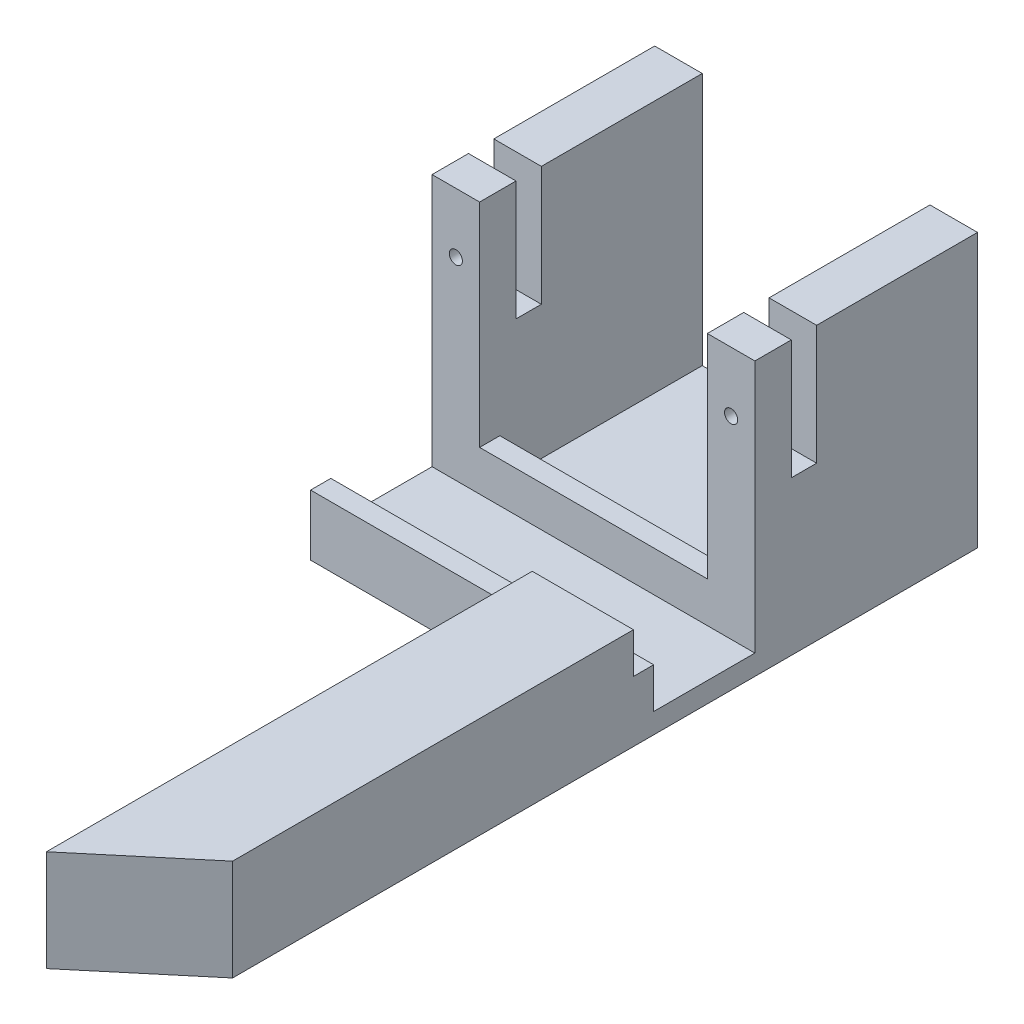
ISO-10303-21;
HEADER;
FILE_DESCRIPTION(('STEP AP214'),'2;1');
FILE_NAME('part.step','',(''),(''),'','','');
FILE_SCHEMA(('AUTOMOTIVE_DESIGN { 1 0 10303 214 1 1 1 1 }'));
ENDSEC;
DATA;
#1=APPLICATION_CONTEXT('core data for automotive mechanical design processes');
#2=APPLICATION_PROTOCOL_DEFINITION('international standard','automotive_design',2000,#1);
#3=PRODUCT_CONTEXT('',#1,'mechanical');
#4=PRODUCT('Part','Part','',(#3));
#5=PRODUCT_RELATED_PRODUCT_CATEGORY('part','',(#4));
#6=PRODUCT_DEFINITION_FORMATION('','',#4);
#7=PRODUCT_DEFINITION_CONTEXT('part definition',#1,'design');
#8=PRODUCT_DEFINITION('design','',#6,#7);
#9=PRODUCT_DEFINITION_SHAPE('','',#8);
#10=(LENGTH_UNIT() NAMED_UNIT(*) SI_UNIT(.MILLI.,.METRE.));
#11=(NAMED_UNIT(*) PLANE_ANGLE_UNIT() SI_UNIT($,.RADIAN.));
#12=(NAMED_UNIT(*) SI_UNIT($,.STERADIAN.) SOLID_ANGLE_UNIT());
#13=UNCERTAINTY_MEASURE_WITH_UNIT(LENGTH_MEASURE(1.E-05),#10,'distance_accuracy_value','');
#14=(GEOMETRIC_REPRESENTATION_CONTEXT(3) GLOBAL_UNCERTAINTY_ASSIGNED_CONTEXT((#13)) GLOBAL_UNIT_ASSIGNED_CONTEXT((#10,
#11,#12)) REPRESENTATION_CONTEXT('',''));
#15=CARTESIAN_POINT('',(0.,0.,0.));
#16=DIRECTION('',(0.,0.,1.));
#17=DIRECTION('',(1.,0.,0.));
#18=AXIS2_PLACEMENT_3D('',#15,#16,#17);
#19=CARTESIAN_POINT('',(-15.95,2.,17.));
#20=DIRECTION('',(0.,0.,-1.));
#21=DIRECTION('',(-1.,0.,0.));
#22=AXIS2_PLACEMENT_3D('',#19,#20,#21);
#23=PLANE('',#22);
#24=DIRECTION('',(0.,-1.,0.));
#25=VECTOR('',#24,1.);
#26=CARTESIAN_POINT('',(5.95,10.,17.));
#27=LINE('',#26,#25);
#28=CARTESIAN_POINT('',(5.95,6.,17.));
#29=VERTEX_POINT('',#28);
#30=CARTESIAN_POINT('',(5.95,0.,17.));
#31=VERTEX_POINT('',#30);
#32=EDGE_CURVE('E11',#29,#31,#27,.T.);
#33=ORIENTED_EDGE('',*,*,#32,.F.);
#34=DIRECTION('',(1.,0.,0.));
#35=VECTOR('',#34,1.);
#36=CARTESIAN_POINT('',(-15.95,6.,17.));
#37=LINE('',#36,#35);
#38=CARTESIAN_POINT('',(-15.95,6.,17.));
#39=VERTEX_POINT('',#38);
#40=EDGE_CURVE('E337',#39,#29,#37,.T.);
#41=ORIENTED_EDGE('',*,*,#40,.F.);
#42=DIRECTION('',(0.,-1.,0.));
#43=VECTOR('',#42,1.);
#44=CARTESIAN_POINT('',(-15.95,2.,17.));
#45=LINE('',#44,#43);
#46=CARTESIAN_POINT('',(-15.95,0.,17.));
#47=VERTEX_POINT('',#46);
#48=EDGE_CURVE('E447',#39,#47,#45,.T.);
#49=ORIENTED_EDGE('',*,*,#48,.T.);
#50=DIRECTION('',(1.,0.,0.));
#51=VECTOR('',#50,1.);
#52=CARTESIAN_POINT('',(-15.95,0.,17.));
#53=LINE('',#52,#51);
#54=EDGE_CURVE('E441',#47,#31,#53,.T.);
#55=ORIENTED_EDGE('',*,*,#54,.T.);
#56=EDGE_LOOP('',(#33,#41,#49,#55));
#57=FACE_BOUND('',#56,.T.);
#58=ADVANCED_FACE('F45',(#57),#23,.F.);
#59=CARTESIAN_POINT('',(-11.25,27.,-17.));
#60=DIRECTION('',(1.,0.,0.));
#61=DIRECTION('',(0.,0.,-1.));
#62=AXIS2_PLACEMENT_3D('',#59,#60,#61);
#63=PLANE('',#62);
#64=DIRECTION('',(0.,0.,1.));
#65=VECTOR('',#64,1.);
#66=CARTESIAN_POINT('',(-11.25,27.,-17.));
#67=LINE('',#66,#65);
#68=CARTESIAN_POINT('',(-11.25,27.,-17.));
#69=VERTEX_POINT('',#68);
#70=CARTESIAN_POINT('',(-11.25,27.,-1.09999999999999));
#71=VERTEX_POINT('',#70);
#72=EDGE_CURVE('E406',#69,#71,#67,.T.);
#73=ORIENTED_EDGE('',*,*,#72,.T.);
#74=DIRECTION('',(0.,-1.,0.));
#75=VECTOR('',#74,1.);
#76=CARTESIAN_POINT('',(-11.25,27.,-1.1));
#77=LINE('',#76,#75);
#78=CARTESIAN_POINT('',(-11.25,15.2,-1.09999999999999));
#79=VERTEX_POINT('',#78);
#80=EDGE_CURVE('E306',#71,#79,#77,.T.);
#81=ORIENTED_EDGE('',*,*,#80,.T.);
#82=DIRECTION('',(0.,0.,1.));
#83=VECTOR('',#82,1.);
#84=CARTESIAN_POINT('',(-11.25,15.2,-17.));
#85=LINE('',#84,#83);
#86=CARTESIAN_POINT('',(-11.25,15.2,1.40000000000001));
#87=VERTEX_POINT('',#86);
#88=EDGE_CURVE('E313',#79,#87,#85,.T.);
#89=ORIENTED_EDGE('',*,*,#88,.T.);
#90=DIRECTION('',(0.,-1.,0.));
#91=VECTOR('',#90,1.);
#92=CARTESIAN_POINT('',(-11.25,27.,1.40000000000001));
#93=LINE('',#92,#91);
#94=CARTESIAN_POINT('',(-11.25,27.,1.40000000000001));
#95=VERTEX_POINT('',#94);
#96=EDGE_CURVE('E300',#95,#87,#93,.T.);
#97=ORIENTED_EDGE('',*,*,#96,.F.);
#98=CARTESIAN_POINT('',(-11.25,27.,5.00000000000001));
#99=VERTEX_POINT('',#98);
#100=EDGE_CURVE('E404',#95,#99,#67,.T.);
#101=ORIENTED_EDGE('',*,*,#100,.T.);
#102=DIRECTION('',(0.,-1.,0.));
#103=VECTOR('',#102,1.);
#104=CARTESIAN_POINT('',(-11.25,27.,5.00000000000001));
#105=LINE('',#104,#103);
#106=CARTESIAN_POINT('',(-11.25,6.,5.00000000000001));
#107=VERTEX_POINT('',#106);
#108=EDGE_CURVE('E432',#99,#107,#105,.T.);
#109=ORIENTED_EDGE('',*,*,#108,.T.);
#110=DIRECTION('',(0.,0.,1.));
#111=VECTOR('',#110,1.);
#112=CARTESIAN_POINT('',(-11.25,6.,5.00000000000001));
#113=LINE('',#112,#111);
#114=CARTESIAN_POINT('',(-11.25,6.,3.00000000000001));
#115=VERTEX_POINT('',#114);
#116=EDGE_CURVE('E343',#115,#107,#113,.T.);
#117=ORIENTED_EDGE('',*,*,#116,.F.);
#118=DIRECTION('',(0.,-1.,0.));
#119=VECTOR('',#118,1.);
#120=CARTESIAN_POINT('',(-11.25,6.,3.00000000000001));
#121=LINE('',#120,#119);
#122=CARTESIAN_POINT('',(-11.25,2.,3.00000000000001));
#123=VERTEX_POINT('',#122);
#124=EDGE_CURVE('E356',#115,#123,#121,.T.);
#125=ORIENTED_EDGE('',*,*,#124,.T.);
#126=DIRECTION('',(0.,0.,1.));
#127=VECTOR('',#126,1.);
#128=CARTESIAN_POINT('',(-11.25,2.,-17.));
#129=LINE('',#128,#127);
#130=CARTESIAN_POINT('',(-11.25,2.,-17.));
#131=VERTEX_POINT('',#130);
#132=EDGE_CURVE('E405',#131,#123,#129,.T.);
#133=ORIENTED_EDGE('',*,*,#132,.F.);
#134=DIRECTION('',(0.,-1.,0.));
#135=VECTOR('',#134,1.);
#136=CARTESIAN_POINT('',(-11.25,27.,-17.));
#137=LINE('',#136,#135);
#138=EDGE_CURVE('E428',#69,#131,#137,.T.);
#139=ORIENTED_EDGE('',*,*,#138,.F.);
#140=EDGE_LOOP('',(#73,#81,#89,#97,#101,#109,#117,#125,#133,#139));
#141=FACE_BOUND('',#140,.T.);
#142=ADVANCED_FACE('F500',(#141),#63,.T.);
#143=CARTESIAN_POINT('',(11.25,27.,-17.));
#144=DIRECTION('',(1.,0.,0.));
#145=DIRECTION('',(0.,0.,-1.));
#146=AXIS2_PLACEMENT_3D('',#143,#144,#145);
#147=PLANE('',#146);
#148=DIRECTION('',(0.,-1.,0.));
#149=VECTOR('',#148,1.);
#150=CARTESIAN_POINT('',(11.25,27.,-1.1));
#151=LINE('',#150,#149);
#152=CARTESIAN_POINT('',(11.25,27.,-1.09999999999999));
#153=VERTEX_POINT('',#152);
#154=CARTESIAN_POINT('',(11.25,15.2,-1.09999999999999));
#155=VERTEX_POINT('',#154);
#156=EDGE_CURVE('E303',#153,#155,#151,.T.);
#157=ORIENTED_EDGE('',*,*,#156,.F.);
#158=DIRECTION('',(0.,0.,1.));
#159=VECTOR('',#158,1.);
#160=CARTESIAN_POINT('',(11.25,27.,-17.));
#161=LINE('',#160,#159);
#162=CARTESIAN_POINT('',(11.25,27.,-17.));
#163=VERTEX_POINT('',#162);
#164=EDGE_CURVE('E393',#163,#153,#161,.T.);
#165=ORIENTED_EDGE('',*,*,#164,.F.);
#166=DIRECTION('',(0.,-1.,0.));
#167=VECTOR('',#166,1.);
#168=CARTESIAN_POINT('',(11.25,27.,-17.));
#169=LINE('',#168,#167);
#170=CARTESIAN_POINT('',(11.25,2.,-17.));
#171=VERTEX_POINT('',#170);
#172=EDGE_CURVE('E365',#163,#171,#169,.T.);
#173=ORIENTED_EDGE('',*,*,#172,.T.);
#174=DIRECTION('',(0.,0.,1.));
#175=VECTOR('',#174,1.);
#176=CARTESIAN_POINT('',(11.25,2.,-17.));
#177=LINE('',#176,#175);
#178=CARTESIAN_POINT('',(11.25,2.,3.00000000000001));
#179=VERTEX_POINT('',#178);
#180=EDGE_CURVE('E378',#171,#179,#177,.T.);
#181=ORIENTED_EDGE('',*,*,#180,.T.);
#182=DIRECTION('',(0.,-1.,0.));
#183=VECTOR('',#182,1.);
#184=CARTESIAN_POINT('',(11.25,6.,3.00000000000001));
#185=LINE('',#184,#183);
#186=CARTESIAN_POINT('',(11.25,6.,3.00000000000001));
#187=VERTEX_POINT('',#186);
#188=EDGE_CURVE('E362',#187,#179,#185,.T.);
#189=ORIENTED_EDGE('',*,*,#188,.F.);
#190=DIRECTION('',(0.,0.,-1.));
#191=VECTOR('',#190,1.);
#192=CARTESIAN_POINT('',(11.25,6.,5.00000000000001));
#193=LINE('',#192,#191);
#194=CARTESIAN_POINT('',(11.25,6.,5.00000000000001));
#195=VERTEX_POINT('',#194);
#196=EDGE_CURVE('E350',#195,#187,#193,.T.);
#197=ORIENTED_EDGE('',*,*,#196,.F.);
#198=DIRECTION('',(0.,-1.,0.));
#199=VECTOR('',#198,1.);
#200=CARTESIAN_POINT('',(11.25,27.,5.00000000000001));
#201=LINE('',#200,#199);
#202=CARTESIAN_POINT('',(11.25,27.,5.00000000000001));
#203=VERTEX_POINT('',#202);
#204=EDGE_CURVE('E369',#203,#195,#201,.T.);
#205=ORIENTED_EDGE('',*,*,#204,.F.);
#206=CARTESIAN_POINT('',(11.25,27.,1.40000000000001));
#207=VERTEX_POINT('',#206);
#208=EDGE_CURVE('E392',#207,#203,#161,.T.);
#209=ORIENTED_EDGE('',*,*,#208,.F.);
#210=DIRECTION('',(0.,-1.,0.));
#211=VECTOR('',#210,1.);
#212=CARTESIAN_POINT('',(11.25,27.,1.40000000000001));
#213=LINE('',#212,#211);
#214=CARTESIAN_POINT('',(11.25,15.2,1.40000000000001));
#215=VERTEX_POINT('',#214);
#216=EDGE_CURVE('E287',#207,#215,#213,.T.);
#217=ORIENTED_EDGE('',*,*,#216,.T.);
#218=DIRECTION('',(0.,0.,1.));
#219=VECTOR('',#218,1.);
#220=CARTESIAN_POINT('',(11.25,15.2,-17.));
#221=LINE('',#220,#219);
#222=EDGE_CURVE('E310',#155,#215,#221,.T.);
#223=ORIENTED_EDGE('',*,*,#222,.F.);
#224=EDGE_LOOP('',(#157,#165,#173,#181,#189,#197,#205,#209,#217,#223));
#225=FACE_BOUND('',#224,.T.);
#226=ADVANCED_FACE('F506',(#225),#147,.F.);
#227=CARTESIAN_POINT('',(15.95,2.,-17.));
#228=DIRECTION('',(-1.,0.,0.));
#229=DIRECTION('',(0.,0.,1.));
#230=AXIS2_PLACEMENT_3D('',#227,#228,#229);
#231=PLANE('',#230);
#232=DIRECTION('',(0.,1.,0.));
#233=VECTOR('',#232,1.);
#234=CARTESIAN_POINT('',(15.95,15.2,-1.09999999999999));
#235=LINE('',#234,#233);
#236=CARTESIAN_POINT('',(15.95,15.2,-1.09999999999999));
#237=VERTEX_POINT('',#236);
#238=CARTESIAN_POINT('',(15.95,27.,-1.09999999999999));
#239=VERTEX_POINT('',#238);
#240=EDGE_CURVE('E284',#237,#239,#235,.T.);
#241=ORIENTED_EDGE('',*,*,#240,.F.);
#242=DIRECTION('',(0.,0.,1.));
#243=VECTOR('',#242,1.);
#244=CARTESIAN_POINT('',(15.95,15.2,0.));
#245=LINE('',#244,#243);
#246=CARTESIAN_POINT('',(15.95,15.2,1.40000000000001));
#247=VERTEX_POINT('',#246);
#248=EDGE_CURVE('E272',#237,#247,#245,.T.);
#249=ORIENTED_EDGE('',*,*,#248,.T.);
#250=DIRECTION('',(0.,1.,0.));
#251=VECTOR('',#250,1.);
#252=CARTESIAN_POINT('',(15.95,15.2,1.40000000000001));
#253=LINE('',#252,#251);
#254=CARTESIAN_POINT('',(15.95,27.,1.40000000000001));
#255=VERTEX_POINT('',#254);
#256=EDGE_CURVE('E288',#247,#255,#253,.T.);
#257=ORIENTED_EDGE('',*,*,#256,.T.);
#258=DIRECTION('',(0.,0.,1.));
#259=VECTOR('',#258,1.);
#260=CARTESIAN_POINT('',(15.95,27.,-17.));
#261=LINE('',#260,#259);
#262=CARTESIAN_POINT('',(15.95,27.,5.));
#263=VERTEX_POINT('',#262);
#264=EDGE_CURVE('E377',#255,#263,#261,.T.);
#265=ORIENTED_EDGE('',*,*,#264,.T.);
#266=DIRECTION('',(0.,-1.,0.));
#267=VECTOR('',#266,1.);
#268=CARTESIAN_POINT('',(15.95,27.,5.));
#269=LINE('',#268,#267);
#270=CARTESIAN_POINT('',(15.95,2.,5.));
#271=VERTEX_POINT('',#270);
#272=EDGE_CURVE('E373',#263,#271,#269,.T.);
#273=ORIENTED_EDGE('',*,*,#272,.T.);
#274=DIRECTION('',(0.,0.,-1.));
#275=VECTOR('',#274,1.);
#276=CARTESIAN_POINT('',(15.95,2.,-17.));
#277=LINE('',#276,#275);
#278=CARTESIAN_POINT('',(15.95,2.,15.));
#279=VERTEX_POINT('',#278);
#280=EDGE_CURVE('E437',#279,#271,#277,.T.);
#281=ORIENTED_EDGE('',*,*,#280,.F.);
#282=DIRECTION('',(0.,-1.,0.));
#283=VECTOR('',#282,1.);
#284=CARTESIAN_POINT('',(15.95,6.,15.));
#285=LINE('',#284,#283);
#286=CARTESIAN_POINT('',(15.95,6.,15.));
#287=VERTEX_POINT('',#286);
#288=EDGE_CURVE('E317',#287,#279,#285,.T.);
#289=ORIENTED_EDGE('',*,*,#288,.F.);
#290=DIRECTION('',(0.,0.,-1.));
#291=VECTOR('',#290,1.);
#292=CARTESIAN_POINT('',(15.95,6.,17.));
#293=LINE('',#292,#291);
#294=CARTESIAN_POINT('',(15.95,6.,17.));
#295=VERTEX_POINT('',#294);
#296=EDGE_CURVE('E334',#295,#287,#293,.T.);
#297=ORIENTED_EDGE('',*,*,#296,.F.);
#298=DIRECTION('',(0.,-1.,0.));
#299=VECTOR('',#298,1.);
#300=CARTESIAN_POINT('',(15.95,10.,17.));
#301=LINE('',#300,#299);
#302=CARTESIAN_POINT('',(15.95,10.,17.));
#303=VERTEX_POINT('',#302);
#304=EDGE_CURVE('E549',#303,#295,#301,.T.);
#305=ORIENTED_EDGE('',*,*,#304,.F.);
#306=DIRECTION('',(0.,0.,1.));
#307=VECTOR('',#306,1.);
#308=CARTESIAN_POINT('',(15.95,10.,17.));
#309=LINE('',#308,#307);
#310=CARTESIAN_POINT('',(15.95,10.,56.6090036882272));
#311=VERTEX_POINT('',#310);
#312=EDGE_CURVE('E234',#303,#311,#309,.T.);
#313=ORIENTED_EDGE('',*,*,#312,.T.);
#314=DIRECTION('',(0.,-1.,0.));
#315=VECTOR('',#314,1.);
#316=CARTESIAN_POINT('',(15.95,10.,56.6090036882272));
#317=LINE('',#316,#315);
#318=CARTESIAN_POINT('',(15.95,0.,56.6090036882272));
#319=VERTEX_POINT('',#318);
#320=EDGE_CURVE('E250',#311,#319,#317,.T.);
#321=ORIENTED_EDGE('',*,*,#320,.T.);
#322=DIRECTION('',(0.,0.,-1.));
#323=VECTOR('',#322,1.);
#324=CARTESIAN_POINT('',(15.95,0.,-17.));
#325=LINE('',#324,#323);
#326=CARTESIAN_POINT('',(15.95,0.,-17.));
#327=VERTEX_POINT('',#326);
#328=EDGE_CURVE('E436',#319,#327,#325,.T.);
#329=ORIENTED_EDGE('',*,*,#328,.T.);
#330=DIRECTION('',(0.,-1.,0.));
#331=VECTOR('',#330,1.);
#332=CARTESIAN_POINT('',(15.95,2.,-17.));
#333=LINE('',#332,#331);
#334=CARTESIAN_POINT('',(15.95,27.,-17.));
#335=VERTEX_POINT('',#334);
#336=EDGE_CURVE('E466',#335,#327,#333,.T.);
#337=ORIENTED_EDGE('',*,*,#336,.F.);
#338=EDGE_CURVE('E384',#335,#239,#261,.T.);
#339=ORIENTED_EDGE('',*,*,#338,.T.);
#340=EDGE_LOOP('',(#241,#249,#257,#265,#273,#281,#289,#297,#305,#313,#321,#329,#337,#339));
#341=FACE_BOUND('',#340,.T.);
#342=ADVANCED_FACE('F47',(#341),#231,.F.);
#343=CARTESIAN_POINT('',(-15.95,2.,-17.));
#344=DIRECTION('',(1.,0.,0.));
#345=DIRECTION('',(0.,0.,-1.));
#346=AXIS2_PLACEMENT_3D('',#343,#344,#345);
#347=PLANE('',#346);
#348=DIRECTION('',(0.,1.,0.));
#349=VECTOR('',#348,1.);
#350=CARTESIAN_POINT('',(-15.95,15.2,-1.09999999999999));
#351=LINE('',#350,#349);
#352=CARTESIAN_POINT('',(-15.95,15.2,-1.09999999999999));
#353=VERTEX_POINT('',#352);
#354=CARTESIAN_POINT('',(-15.95,27.,-1.09999999999999));
#355=VERTEX_POINT('',#354);
#356=EDGE_CURVE('E276',#353,#355,#351,.T.);
#357=ORIENTED_EDGE('',*,*,#356,.T.);
#358=DIRECTION('',(0.,0.,1.));
#359=VECTOR('',#358,1.);
#360=CARTESIAN_POINT('',(-15.95,27.,-17.));
#361=LINE('',#360,#359);
#362=CARTESIAN_POINT('',(-15.95,27.,-17.));
#363=VERTEX_POINT('',#362);
#364=EDGE_CURVE('E415',#363,#355,#361,.T.);
#365=ORIENTED_EDGE('',*,*,#364,.F.);
#366=DIRECTION('',(0.,-1.,0.));
#367=VECTOR('',#366,1.);
#368=CARTESIAN_POINT('',(-15.95,2.,-17.));
#369=LINE('',#368,#367);
#370=CARTESIAN_POINT('',(-15.95,0.,-17.));
#371=VERTEX_POINT('',#370);
#372=EDGE_CURVE('E462',#363,#371,#369,.T.);
#373=ORIENTED_EDGE('',*,*,#372,.T.);
#374=DIRECTION('',(0.,0.,1.));
#375=VECTOR('',#374,1.);
#376=CARTESIAN_POINT('',(-15.95,0.,-17.));
#377=LINE('',#376,#375);
#378=EDGE_CURVE('E454',#371,#47,#377,.T.);
#379=ORIENTED_EDGE('',*,*,#378,.T.);
#380=ORIENTED_EDGE('',*,*,#48,.F.);
#381=DIRECTION('',(0.,0.,1.));
#382=VECTOR('',#381,1.);
#383=CARTESIAN_POINT('',(-15.95,6.,17.));
#384=LINE('',#383,#382);
#385=CARTESIAN_POINT('',(-15.95,6.,15.));
#386=VERTEX_POINT('',#385);
#387=EDGE_CURVE('E331',#386,#39,#384,.T.);
#388=ORIENTED_EDGE('',*,*,#387,.F.);
#389=DIRECTION('',(0.,-1.,0.));
#390=VECTOR('',#389,1.);
#391=CARTESIAN_POINT('',(-15.95,6.,15.));
#392=LINE('',#391,#390);
#393=CARTESIAN_POINT('',(-15.95,2.,15.));
#394=VERTEX_POINT('',#393);
#395=EDGE_CURVE('E321',#386,#394,#392,.T.);
#396=ORIENTED_EDGE('',*,*,#395,.T.);
#397=DIRECTION('',(0.,0.,1.));
#398=VECTOR('',#397,1.);
#399=CARTESIAN_POINT('',(-15.95,2.,-17.));
#400=LINE('',#399,#398);
#401=CARTESIAN_POINT('',(-15.95,2.,5.00000000000001));
#402=VERTEX_POINT('',#401);
#403=EDGE_CURVE('E444',#402,#394,#400,.T.);
#404=ORIENTED_EDGE('',*,*,#403,.F.);
#405=DIRECTION('',(0.,-1.,0.));
#406=VECTOR('',#405,1.);
#407=CARTESIAN_POINT('',(-15.95,27.,5.00000000000001));
#408=LINE('',#407,#406);
#409=CARTESIAN_POINT('',(-15.95,27.,5.00000000000001));
#410=VERTEX_POINT('',#409);
#411=EDGE_CURVE('E419',#410,#402,#408,.T.);
#412=ORIENTED_EDGE('',*,*,#411,.F.);
#413=CARTESIAN_POINT('',(-15.95,27.,1.40000000000001));
#414=VERTEX_POINT('',#413);
#415=EDGE_CURVE('E414',#414,#410,#361,.T.);
#416=ORIENTED_EDGE('',*,*,#415,.F.);
#417=DIRECTION('',(0.,1.,0.));
#418=VECTOR('',#417,1.);
#419=CARTESIAN_POINT('',(-15.95,15.2,1.40000000000001));
#420=LINE('',#419,#418);
#421=CARTESIAN_POINT('',(-15.95,15.2,1.40000000000001));
#422=VERTEX_POINT('',#421);
#423=EDGE_CURVE('E70',#422,#414,#420,.T.);
#424=ORIENTED_EDGE('',*,*,#423,.F.);
#425=DIRECTION('',(0.,0.,1.));
#426=VECTOR('',#425,1.);
#427=CARTESIAN_POINT('',(-15.95,15.2,0.));
#428=LINE('',#427,#426);
#429=EDGE_CURVE('E262',#353,#422,#428,.T.);
#430=ORIENTED_EDGE('',*,*,#429,.F.);
#431=EDGE_LOOP('',(#357,#365,#373,#379,#380,#388,#396,#404,#412,#416,#424,#430));
#432=FACE_BOUND('',#431,.T.);
#433=ADVANCED_FACE('F513',(#432),#347,.F.);
#434=CARTESIAN_POINT('',(0.,27.,0.));
#435=DIRECTION('',(0.,-1.,0.));
#436=DIRECTION('',(0.,0.,-1.));
#437=AXIS2_PLACEMENT_3D('',#434,#435,#436);
#438=PLANE('',#437);
#439=DIRECTION('',(1.,0.,0.));
#440=VECTOR('',#439,1.);
#441=CARTESIAN_POINT('',(0.,27.,-1.09999999999999));
#442=LINE('',#441,#440);
#443=EDGE_CURVE('E277',#355,#71,#442,.T.);
#444=ORIENTED_EDGE('',*,*,#443,.T.);
#445=ORIENTED_EDGE('',*,*,#72,.F.);
#446=DIRECTION('',(1.,0.,0.));
#447=VECTOR('',#446,1.);
#448=CARTESIAN_POINT('',(-15.95,27.,-17.));
#449=LINE('',#448,#447);
#450=EDGE_CURVE('E410',#363,#69,#449,.T.);
#451=ORIENTED_EDGE('',*,*,#450,.F.);
#452=ORIENTED_EDGE('',*,*,#364,.T.);
#453=EDGE_LOOP('',(#444,#445,#451,#452));
#454=FACE_BOUND('',#453,.T.);
#455=ADVANCED_FACE('F515',(#454),#438,.F.);
#456=CARTESIAN_POINT('',(0.,27.,0.));
#457=DIRECTION('',(0.,1.,0.));
#458=DIRECTION('',(0.,0.,1.));
#459=AXIS2_PLACEMENT_3D('',#456,#457,#458);
#460=PLANE('',#459);
#461=ORIENTED_EDGE('',*,*,#164,.T.);
#462=DIRECTION('',(1.,0.,0.));
#463=VECTOR('',#462,1.);
#464=CARTESIAN_POINT('',(0.,27.,-1.09999999999999));
#465=LINE('',#464,#463);
#466=EDGE_CURVE('E55',#153,#239,#465,.T.);
#467=ORIENTED_EDGE('',*,*,#466,.T.);
#468=ORIENTED_EDGE('',*,*,#338,.F.);
#469=DIRECTION('',(-1.,0.,0.));
#470=VECTOR('',#469,1.);
#471=CARTESIAN_POINT('',(15.95,27.,-17.));
#472=LINE('',#471,#470);
#473=EDGE_CURVE('E383',#335,#163,#472,.T.);
#474=ORIENTED_EDGE('',*,*,#473,.T.);
#475=EDGE_LOOP('',(#461,#467,#468,#474));
#476=FACE_BOUND('',#475,.T.);
#477=ADVANCED_FACE('F579',(#476),#460,.T.);
#478=CARTESIAN_POINT('',(0.,2.,0.));
#479=DIRECTION('',(0.,1.,0.));
#480=DIRECTION('',(0.,0.,1.));
#481=AXIS2_PLACEMENT_3D('',#478,#479,#480);
#482=PLANE('',#481);
#483=ORIENTED_EDGE('',*,*,#403,.T.);
#484=DIRECTION('',(-1.,0.,0.));
#485=VECTOR('',#484,1.);
#486=CARTESIAN_POINT('',(-15.95,2.,15.));
#487=LINE('',#486,#485);
#488=EDGE_CURVE('E326',#279,#394,#487,.T.);
#489=ORIENTED_EDGE('',*,*,#488,.F.);
#490=ORIENTED_EDGE('',*,*,#280,.T.);
#491=DIRECTION('',(1.,0.,0.));
#492=VECTOR('',#491,1.);
#493=CARTESIAN_POINT('',(-15.95,2.,5.00000000000001));
#494=LINE('',#493,#492);
#495=EDGE_CURVE('E382',#402,#271,#494,.T.);
#496=ORIENTED_EDGE('',*,*,#495,.F.);
#497=EDGE_LOOP('',(#483,#489,#490,#496));
#498=FACE_BOUND('',#497,.T.);
#499=ADVANCED_FACE('F528',(#498),#482,.T.);
#500=ORIENTED_EDGE('',*,*,#132,.T.);
#501=DIRECTION('',(-1.,0.,0.));
#502=VECTOR('',#501,1.);
#503=CARTESIAN_POINT('',(-11.25,2.,3.00000000000001));
#504=LINE('',#503,#502);
#505=EDGE_CURVE('E330',#179,#123,#504,.T.);
#506=ORIENTED_EDGE('',*,*,#505,.F.);
#507=ORIENTED_EDGE('',*,*,#180,.F.);
#508=DIRECTION('',(-1.,0.,0.));
#509=VECTOR('',#508,1.);
#510=CARTESIAN_POINT('',(-15.95,2.,-17.));
#511=LINE('',#510,#509);
#512=EDGE_CURVE('E440',#171,#131,#511,.T.);
#513=ORIENTED_EDGE('',*,*,#512,.T.);
#514=EDGE_LOOP('',(#500,#506,#507,#513));
#515=FACE_BOUND('',#514,.T.);
#516=ADVANCED_FACE('F519',(#515),#482,.T.);
#517=CARTESIAN_POINT('',(-15.95,2.,-17.));
#518=DIRECTION('',(0.,0.,1.));
#519=DIRECTION('',(1.,0.,0.));
#520=AXIS2_PLACEMENT_3D('',#517,#518,#519);
#521=PLANE('',#520);
#522=DIRECTION('',(-1.,0.,0.));
#523=VECTOR('',#522,1.);
#524=CARTESIAN_POINT('',(-15.95,0.,-17.));
#525=LINE('',#524,#523);
#526=EDGE_CURVE('E451',#327,#371,#525,.T.);
#527=ORIENTED_EDGE('',*,*,#526,.T.);
#528=ORIENTED_EDGE('',*,*,#372,.F.);
#529=ORIENTED_EDGE('',*,*,#450,.T.);
#530=ORIENTED_EDGE('',*,*,#138,.T.);
#531=ORIENTED_EDGE('',*,*,#512,.F.);
#532=ORIENTED_EDGE('',*,*,#172,.F.);
#533=ORIENTED_EDGE('',*,*,#473,.F.);
#534=ORIENTED_EDGE('',*,*,#336,.T.);
#535=EDGE_LOOP('',(#527,#528,#529,#530,#531,#532,#533,#534));
#536=FACE_BOUND('',#535,.T.);
#537=ADVANCED_FACE('F517',(#536),#521,.F.);
#538=CARTESIAN_POINT('',(0.,0.,0.));
#539=DIRECTION('',(0.,1.,0.));
#540=DIRECTION('',(0.,0.,1.));
#541=AXIS2_PLACEMENT_3D('',#538,#539,#540);
#542=PLANE('',#541);
#543=ORIENTED_EDGE('',*,*,#328,.F.);
#544=DIRECTION('',(0.766044443118977,0.,-0.642787609686541));
#545=VECTOR('',#544,1.);
#546=CARTESIAN_POINT('',(5.95000000000001,0.,65.));
#547=LINE('',#546,#545);
#548=CARTESIAN_POINT('',(5.95000000000001,0.,65.));
#549=VERTEX_POINT('',#548);
#550=EDGE_CURVE('E238',#549,#319,#547,.T.);
#551=ORIENTED_EDGE('',*,*,#550,.F.);
#552=DIRECTION('',(0.,0.,1.));
#553=VECTOR('',#552,1.);
#554=CARTESIAN_POINT('',(5.95,0.,17.));
#555=LINE('',#554,#553);
#556=EDGE_CURVE('E537',#31,#549,#555,.T.);
#557=ORIENTED_EDGE('',*,*,#556,.F.);
#558=ORIENTED_EDGE('',*,*,#54,.F.);
#559=ORIENTED_EDGE('',*,*,#378,.F.);
#560=ORIENTED_EDGE('',*,*,#526,.F.);
#561=EDGE_LOOP('',(#543,#551,#557,#558,#559,#560));
#562=FACE_BOUND('',#561,.T.);
#563=ADVANCED_FACE('F511',(#562),#542,.F.);
#564=CARTESIAN_POINT('',(-15.95,27.,5.00000000000001));
#565=DIRECTION('',(0.,0.,-1.));
#566=DIRECTION('',(-1.,0.,0.));
#567=AXIS2_PLACEMENT_3D('',#564,#565,#566);
#568=PLANE('',#567);
#569=CARTESIAN_POINT('',(13.6,21.1,5.00000000000001));
#570=DIRECTION('',(0.,0.,1.));
#571=DIRECTION('',(1.,0.,0.));
#572=AXIS2_PLACEMENT_3D('',#569,#570,#571);
#573=CIRCLE('',#572,0.649999999999999);
#574=CARTESIAN_POINT('',(14.25,21.1,5.00000000000001));
#575=VERTEX_POINT('',#574);
#576=EDGE_CURVE('E248',#575,#575,#573,.T.);
#577=ORIENTED_EDGE('',*,*,#576,.F.);
#578=EDGE_LOOP('',(#577));
#579=FACE_BOUND('',#578,.T.);
#580=CARTESIAN_POINT('',(-13.6,21.1,5.00000000000001));
#581=DIRECTION('',(0.,0.,1.));
#582=DIRECTION('',(1.,0.,0.));
#583=AXIS2_PLACEMENT_3D('',#580,#581,#582);
#584=CIRCLE('',#583,0.649999999999999);
#585=CARTESIAN_POINT('',(-12.95,21.1,5.00000000000001));
#586=VERTEX_POINT('',#585);
#587=EDGE_CURVE('E244',#586,#586,#584,.T.);
#588=ORIENTED_EDGE('',*,*,#587,.F.);
#589=EDGE_LOOP('',(#588));
#590=FACE_BOUND('',#589,.T.);
#591=ORIENTED_EDGE('',*,*,#495,.T.);
#592=ORIENTED_EDGE('',*,*,#272,.F.);
#593=DIRECTION('',(-1.,0.,0.));
#594=VECTOR('',#593,1.);
#595=CARTESIAN_POINT('',(15.95,27.,5.));
#596=LINE('',#595,#594);
#597=EDGE_CURVE('E388',#263,#203,#596,.T.);
#598=ORIENTED_EDGE('',*,*,#597,.T.);
#599=ORIENTED_EDGE('',*,*,#204,.T.);
#600=DIRECTION('',(1.,0.,0.));
#601=VECTOR('',#600,1.);
#602=CARTESIAN_POINT('',(-11.25,6.,5.00000000000001));
#603=LINE('',#602,#601);
#604=EDGE_CURVE('E347',#107,#195,#603,.T.);
#605=ORIENTED_EDGE('',*,*,#604,.F.);
#606=ORIENTED_EDGE('',*,*,#108,.F.);
#607=DIRECTION('',(1.,0.,0.));
#608=VECTOR('',#607,1.);
#609=CARTESIAN_POINT('',(-15.95,27.,5.00000000000001));
#610=LINE('',#609,#608);
#611=EDGE_CURVE('E400',#410,#99,#610,.T.);
#612=ORIENTED_EDGE('',*,*,#611,.F.);
#613=ORIENTED_EDGE('',*,*,#411,.T.);
#614=EDGE_LOOP('',(#591,#592,#598,#599,#605,#606,#612,#613));
#615=FACE_BOUND('',#614,.T.);
#616=ADVANCED_FACE('F525',(#579,#590,#615),#568,.F.);
#617=ORIENTED_EDGE('',*,*,#100,.F.);
#618=DIRECTION('',(1.,0.,0.));
#619=VECTOR('',#618,1.);
#620=CARTESIAN_POINT('',(0.,27.,1.40000000000001));
#621=LINE('',#620,#619);
#622=EDGE_CURVE('E281',#414,#95,#621,.T.);
#623=ORIENTED_EDGE('',*,*,#622,.F.);
#624=ORIENTED_EDGE('',*,*,#415,.T.);
#625=ORIENTED_EDGE('',*,*,#611,.T.);
#626=EDGE_LOOP('',(#617,#623,#624,#625));
#627=FACE_BOUND('',#626,.T.);
#628=ADVANCED_FACE('F597',(#627),#438,.F.);
#629=DIRECTION('',(1.,0.,0.));
#630=VECTOR('',#629,1.);
#631=CARTESIAN_POINT('',(0.,27.,1.40000000000001));
#632=LINE('',#631,#630);
#633=EDGE_CURVE('E470',#207,#255,#632,.T.);
#634=ORIENTED_EDGE('',*,*,#633,.F.);
#635=ORIENTED_EDGE('',*,*,#208,.T.);
#636=ORIENTED_EDGE('',*,*,#597,.F.);
#637=ORIENTED_EDGE('',*,*,#264,.F.);
#638=EDGE_LOOP('',(#634,#635,#636,#637));
#639=FACE_BOUND('',#638,.T.);
#640=ADVANCED_FACE('F588',(#639),#460,.T.);
#641=CARTESIAN_POINT('',(-11.25,6.,3.00000000000001));
#642=DIRECTION('',(0.,0.,1.));
#643=DIRECTION('',(1.,0.,0.));
#644=AXIS2_PLACEMENT_3D('',#641,#642,#643);
#645=PLANE('',#644);
#646=ORIENTED_EDGE('',*,*,#505,.T.);
#647=ORIENTED_EDGE('',*,*,#124,.F.);
#648=DIRECTION('',(-1.,0.,0.));
#649=VECTOR('',#648,1.);
#650=CARTESIAN_POINT('',(-11.25,6.,3.00000000000001));
#651=LINE('',#650,#649);
#652=EDGE_CURVE('E353',#187,#115,#651,.T.);
#653=ORIENTED_EDGE('',*,*,#652,.F.);
#654=ORIENTED_EDGE('',*,*,#188,.T.);
#655=EDGE_LOOP('',(#646,#647,#653,#654));
#656=FACE_BOUND('',#655,.T.);
#657=ADVANCED_FACE('F621',(#656),#645,.F.);
#658=CARTESIAN_POINT('',(0.,6.,0.));
#659=DIRECTION('',(0.,-1.,0.));
#660=DIRECTION('',(0.,0.,-1.));
#661=AXIS2_PLACEMENT_3D('',#658,#659,#660);
#662=PLANE('',#661);
#663=ORIENTED_EDGE('',*,*,#116,.T.);
#664=ORIENTED_EDGE('',*,*,#604,.T.);
#665=ORIENTED_EDGE('',*,*,#196,.T.);
#666=ORIENTED_EDGE('',*,*,#652,.T.);
#667=EDGE_LOOP('',(#663,#664,#665,#666));
#668=FACE_BOUND('',#667,.T.);
#669=ADVANCED_FACE('F623',(#668),#662,.F.);
#670=CARTESIAN_POINT('',(-15.95,6.,15.));
#671=DIRECTION('',(0.,0.,1.));
#672=DIRECTION('',(1.,0.,0.));
#673=AXIS2_PLACEMENT_3D('',#670,#671,#672);
#674=PLANE('',#673);
#675=ORIENTED_EDGE('',*,*,#488,.T.);
#676=ORIENTED_EDGE('',*,*,#395,.F.);
#677=DIRECTION('',(-1.,0.,0.));
#678=VECTOR('',#677,1.);
#679=CARTESIAN_POINT('',(-15.95,6.,15.));
#680=LINE('',#679,#678);
#681=EDGE_CURVE('E325',#287,#386,#680,.T.);
#682=ORIENTED_EDGE('',*,*,#681,.F.);
#683=ORIENTED_EDGE('',*,*,#288,.T.);
#684=EDGE_LOOP('',(#675,#676,#682,#683));
#685=FACE_BOUND('',#684,.T.);
#686=ADVANCED_FACE('F625',(#685),#674,.F.);
#687=CARTESIAN_POINT('',(0.,6.,0.));
#688=DIRECTION('',(0.,-1.,0.));
#689=DIRECTION('',(0.,0.,-1.));
#690=AXIS2_PLACEMENT_3D('',#687,#688,#689);
#691=PLANE('',#690);
#692=ORIENTED_EDGE('',*,*,#387,.T.);
#693=ORIENTED_EDGE('',*,*,#40,.T.);
#694=EDGE_CURVE('E242',#29,#295,#37,.T.);
#695=ORIENTED_EDGE('',*,*,#694,.T.);
#696=ORIENTED_EDGE('',*,*,#296,.T.);
#697=ORIENTED_EDGE('',*,*,#681,.T.);
#698=EDGE_LOOP('',(#692,#693,#695,#696,#697));
#699=FACE_BOUND('',#698,.T.);
#700=ADVANCED_FACE('F562',(#699),#691,.F.);
#701=CARTESIAN_POINT('',(0.,15.2,1.40000000000001));
#702=DIRECTION('',(0.,0.,1.));
#703=DIRECTION('',(1.,0.,0.));
#704=AXIS2_PLACEMENT_3D('',#701,#702,#703);
#705=PLANE('',#704);
#706=CARTESIAN_POINT('',(13.6,21.1,1.40000000000001));
#707=DIRECTION('',(0.,0.,1.));
#708=DIRECTION('',(1.,0.,0.));
#709=AXIS2_PLACEMENT_3D('',#706,#707,#708);
#710=CIRCLE('',#709,0.649999999999999);
#711=CARTESIAN_POINT('',(14.25,21.1,1.40000000000001));
#712=VERTEX_POINT('',#711);
#713=EDGE_CURVE('E49',#712,#712,#710,.T.);
#714=ORIENTED_EDGE('',*,*,#713,.T.);
#715=EDGE_LOOP('',(#714));
#716=FACE_BOUND('',#715,.T.);
#717=ORIENTED_EDGE('',*,*,#633,.T.);
#718=ORIENTED_EDGE('',*,*,#256,.F.);
#719=DIRECTION('',(1.,0.,0.));
#720=VECTOR('',#719,1.);
#721=CARTESIAN_POINT('',(0.,15.2,1.40000000000001));
#722=LINE('',#721,#720);
#723=EDGE_CURVE('E267',#215,#247,#722,.T.);
#724=ORIENTED_EDGE('',*,*,#723,.F.);
#725=ORIENTED_EDGE('',*,*,#216,.F.);
#726=EDGE_LOOP('',(#717,#718,#724,#725));
#727=FACE_BOUND('',#726,.T.);
#728=ADVANCED_FACE('F483',(#716,#727),#705,.F.);
#729=CARTESIAN_POINT('',(0.,15.2,-1.09999999999999));
#730=DIRECTION('',(0.,0.,1.));
#731=DIRECTION('',(1.,0.,0.));
#732=AXIS2_PLACEMENT_3D('',#729,#730,#731);
#733=PLANE('',#732);
#734=ORIENTED_EDGE('',*,*,#156,.T.);
#735=DIRECTION('',(1.,0.,0.));
#736=VECTOR('',#735,1.);
#737=CARTESIAN_POINT('',(0.,15.2,-1.09999999999999));
#738=LINE('',#737,#736);
#739=EDGE_CURVE('E263',#155,#237,#738,.T.);
#740=ORIENTED_EDGE('',*,*,#739,.T.);
#741=ORIENTED_EDGE('',*,*,#240,.T.);
#742=ORIENTED_EDGE('',*,*,#466,.F.);
#743=EDGE_LOOP('',(#734,#740,#741,#742));
#744=FACE_BOUND('',#743,.T.);
#745=ADVANCED_FACE('F570',(#744),#733,.T.);
#746=CARTESIAN_POINT('',(0.,15.2,0.));
#747=DIRECTION('',(0.,1.,0.));
#748=DIRECTION('',(0.,0.,1.));
#749=AXIS2_PLACEMENT_3D('',#746,#747,#748);
#750=PLANE('',#749);
#751=ORIENTED_EDGE('',*,*,#222,.T.);
#752=ORIENTED_EDGE('',*,*,#723,.T.);
#753=ORIENTED_EDGE('',*,*,#248,.F.);
#754=ORIENTED_EDGE('',*,*,#739,.F.);
#755=EDGE_LOOP('',(#751,#752,#753,#754));
#756=FACE_BOUND('',#755,.T.);
#757=ADVANCED_FACE('F574',(#756),#750,.T.);
#758=ORIENTED_EDGE('',*,*,#443,.F.);
#759=ORIENTED_EDGE('',*,*,#356,.F.);
#760=EDGE_CURVE('E258',#353,#79,#738,.T.);
#761=ORIENTED_EDGE('',*,*,#760,.T.);
#762=ORIENTED_EDGE('',*,*,#80,.F.);
#763=EDGE_LOOP('',(#758,#759,#761,#762));
#764=FACE_BOUND('',#763,.T.);
#765=ADVANCED_FACE('F758',(#764),#733,.T.);
#766=CARTESIAN_POINT('',(-13.6,21.1,1.40000000000001));
#767=DIRECTION('',(0.,0.,1.));
#768=DIRECTION('',(1.,0.,0.));
#769=AXIS2_PLACEMENT_3D('',#766,#767,#768);
#770=CIRCLE('',#769,0.649999999999999);
#771=CARTESIAN_POINT('',(-12.95,21.1,1.40000000000001));
#772=VERTEX_POINT('',#771);
#773=EDGE_CURVE('E256',#772,#772,#770,.T.);
#774=ORIENTED_EDGE('',*,*,#773,.T.);
#775=EDGE_LOOP('',(#774));
#776=FACE_BOUND('',#775,.T.);
#777=ORIENTED_EDGE('',*,*,#96,.T.);
#778=EDGE_CURVE('E268',#422,#87,#722,.T.);
#779=ORIENTED_EDGE('',*,*,#778,.F.);
#780=ORIENTED_EDGE('',*,*,#423,.T.);
#781=ORIENTED_EDGE('',*,*,#622,.T.);
#782=EDGE_LOOP('',(#777,#779,#780,#781));
#783=FACE_BOUND('',#782,.T.);
#784=ADVANCED_FACE('F605',(#776,#783),#705,.F.);
#785=ORIENTED_EDGE('',*,*,#760,.F.);
#786=ORIENTED_EDGE('',*,*,#429,.T.);
#787=ORIENTED_EDGE('',*,*,#778,.T.);
#788=ORIENTED_EDGE('',*,*,#88,.F.);
#789=EDGE_LOOP('',(#785,#786,#787,#788));
#790=FACE_BOUND('',#789,.T.);
#791=ADVANCED_FACE('F497',(#790),#750,.T.);
#792=CARTESIAN_POINT('',(-13.6,21.1,1.00000000000001));
#793=DIRECTION('',(0.,0.,1.));
#794=DIRECTION('',(1.,0.,0.));
#795=AXIS2_PLACEMENT_3D('',#792,#793,#794);
#796=CYLINDRICAL_SURFACE('',#795,0.649999999999999);
#797=ORIENTED_EDGE('',*,*,#587,.T.);
#798=EDGE_LOOP('',(#797));
#799=FACE_BOUND('',#798,.T.);
#800=ORIENTED_EDGE('',*,*,#773,.F.);
#801=EDGE_LOOP('',(#800));
#802=FACE_BOUND('',#801,.T.);
#803=ADVANCED_FACE('F488',(#799,#802),#796,.F.);
#804=CARTESIAN_POINT('',(13.6,21.1,1.00000000000001));
#805=DIRECTION('',(0.,0.,1.));
#806=DIRECTION('',(1.,0.,0.));
#807=AXIS2_PLACEMENT_3D('',#804,#805,#806);
#808=CYLINDRICAL_SURFACE('',#807,0.649999999999999);
#809=ORIENTED_EDGE('',*,*,#576,.T.);
#810=EDGE_LOOP('',(#809));
#811=FACE_BOUND('',#810,.T.);
#812=ORIENTED_EDGE('',*,*,#713,.F.);
#813=EDGE_LOOP('',(#812));
#814=FACE_BOUND('',#813,.T.);
#815=ADVANCED_FACE('F486',(#811,#814),#808,.F.);
#816=CARTESIAN_POINT('',(15.95,10.,17.));
#817=DIRECTION('',(0.,0.,1.));
#818=DIRECTION('',(1.,0.,0.));
#819=AXIS2_PLACEMENT_3D('',#816,#817,#818);
#820=PLANE('',#819);
#821=ORIENTED_EDGE('',*,*,#694,.F.);
#822=CARTESIAN_POINT('',(5.95,10.,17.));
#823=VERTEX_POINT('',#822);
#824=EDGE_CURVE('E57',#823,#29,#27,.T.);
#825=ORIENTED_EDGE('',*,*,#824,.F.);
#826=DIRECTION('',(-1.,0.,0.));
#827=VECTOR('',#826,1.);
#828=CARTESIAN_POINT('',(15.95,10.,17.));
#829=LINE('',#828,#827);
#830=EDGE_CURVE('E228',#303,#823,#829,.T.);
#831=ORIENTED_EDGE('',*,*,#830,.F.);
#832=ORIENTED_EDGE('',*,*,#304,.T.);
#833=EDGE_LOOP('',(#821,#825,#831,#832));
#834=FACE_BOUND('',#833,.T.);
#835=ADVANCED_FACE('F241',(#834),#820,.F.);
#836=CARTESIAN_POINT('',(5.95,10.,17.));
#837=DIRECTION('',(1.,0.,0.));
#838=DIRECTION('',(0.,0.,-1.));
#839=AXIS2_PLACEMENT_3D('',#836,#837,#838);
#840=PLANE('',#839);
#841=ORIENTED_EDGE('',*,*,#556,.T.);
#842=DIRECTION('',(0.,-1.,0.));
#843=VECTOR('',#842,1.);
#844=CARTESIAN_POINT('',(5.95000000000001,10.,65.));
#845=LINE('',#844,#843);
#846=CARTESIAN_POINT('',(5.95000000000001,10.,65.));
#847=VERTEX_POINT('',#846);
#848=EDGE_CURVE('E223',#847,#549,#845,.T.);
#849=ORIENTED_EDGE('',*,*,#848,.F.);
#850=DIRECTION('',(0.,0.,1.));
#851=VECTOR('',#850,1.);
#852=CARTESIAN_POINT('',(5.95,10.,17.));
#853=LINE('',#852,#851);
#854=EDGE_CURVE('E218',#823,#847,#853,.T.);
#855=ORIENTED_EDGE('',*,*,#854,.F.);
#856=ORIENTED_EDGE('',*,*,#824,.T.);
#857=ORIENTED_EDGE('',*,*,#32,.T.);
#858=EDGE_LOOP('',(#841,#849,#855,#856,#857));
#859=FACE_BOUND('',#858,.T.);
#860=ADVANCED_FACE('F220',(#859),#840,.F.);
#861=CARTESIAN_POINT('',(5.95000000000001,10.,65.));
#862=DIRECTION('',(-0.642787609686541,0.,-0.766044443118977));
#863=DIRECTION('',(-0.766044443118976,0.,0.642787609686541));
#864=AXIS2_PLACEMENT_3D('',#861,#862,#863);
#865=PLANE('',#864);
#866=ORIENTED_EDGE('',*,*,#550,.T.);
#867=ORIENTED_EDGE('',*,*,#320,.F.);
#868=DIRECTION('',(0.766044443118977,0.,-0.642787609686541));
#869=VECTOR('',#868,1.);
#870=CARTESIAN_POINT('',(5.95000000000001,10.,65.));
#871=LINE('',#870,#869);
#872=EDGE_CURVE('E227',#847,#311,#871,.T.);
#873=ORIENTED_EDGE('',*,*,#872,.F.);
#874=ORIENTED_EDGE('',*,*,#848,.T.);
#875=EDGE_LOOP('',(#866,#867,#873,#874));
#876=FACE_BOUND('',#875,.T.);
#877=ADVANCED_FACE('F542',(#876),#865,.F.);
#878=CARTESIAN_POINT('',(0.,10.,0.));
#879=DIRECTION('',(0.,1.,0.));
#880=DIRECTION('',(0.,0.,1.));
#881=AXIS2_PLACEMENT_3D('',#878,#879,#880);
#882=PLANE('',#881);
#883=ORIENTED_EDGE('',*,*,#830,.T.);
#884=ORIENTED_EDGE('',*,*,#854,.T.);
#885=ORIENTED_EDGE('',*,*,#872,.T.);
#886=ORIENTED_EDGE('',*,*,#312,.F.);
#887=EDGE_LOOP('',(#883,#884,#885,#886));
#888=FACE_BOUND('',#887,.T.);
#889=ADVANCED_FACE('F232',(#888),#882,.T.);
#890=CLOSED_SHELL('',(#58,#142,#226,#342,#433,#455,#477,#499,#516,#537,#563,#616,#628,#640,#657,
#669,#686,#700,#728,#745,#757,#765,#784,#791,#803,#815,#835,#860,#877,#889));
#891=MANIFOLD_SOLID_BREP('B2',#890);
#892=ADVANCED_BREP_SHAPE_REPRESENTATION('',(#18,#891),#14);
#893=SHAPE_DEFINITION_REPRESENTATION(#9,#892);
ENDSEC;
END-ISO-10303-21;
